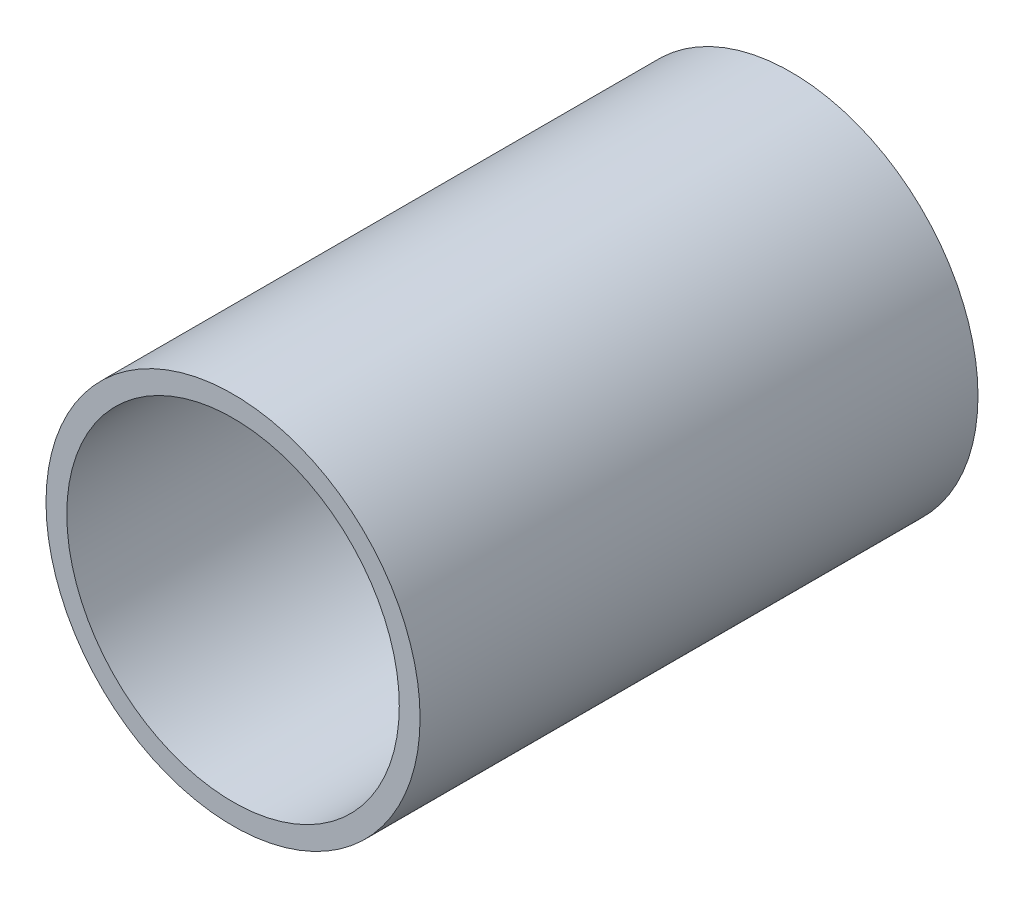
ISO-10303-21;
HEADER;
FILE_DESCRIPTION(('STEP AP214'),'2;1');
FILE_NAME('part.step','',(''),(''),'','','');
FILE_SCHEMA(('AUTOMOTIVE_DESIGN { 1 0 10303 214 1 1 1 1 }'));
ENDSEC;
DATA;
#1=APPLICATION_CONTEXT('core data for automotive mechanical design processes');
#2=APPLICATION_PROTOCOL_DEFINITION('international standard','automotive_design',2000,#1);
#3=PRODUCT_CONTEXT('',#1,'mechanical');
#4=PRODUCT('Part','Part','',(#3));
#5=PRODUCT_RELATED_PRODUCT_CATEGORY('part','',(#4));
#6=PRODUCT_DEFINITION_FORMATION('','',#4);
#7=PRODUCT_DEFINITION_CONTEXT('part definition',#1,'design');
#8=PRODUCT_DEFINITION('design','',#6,#7);
#9=PRODUCT_DEFINITION_SHAPE('','',#8);
#10=(LENGTH_UNIT() NAMED_UNIT(*) SI_UNIT(.MILLI.,.METRE.));
#11=(NAMED_UNIT(*) PLANE_ANGLE_UNIT() SI_UNIT($,.RADIAN.));
#12=(NAMED_UNIT(*) SI_UNIT($,.STERADIAN.) SOLID_ANGLE_UNIT());
#13=UNCERTAINTY_MEASURE_WITH_UNIT(LENGTH_MEASURE(1.E-05),#10,'distance_accuracy_value','');
#14=(GEOMETRIC_REPRESENTATION_CONTEXT(3) GLOBAL_UNCERTAINTY_ASSIGNED_CONTEXT((#13)) GLOBAL_UNIT_ASSIGNED_CONTEXT((#10,
#11,#12)) REPRESENTATION_CONTEXT('',''));
#15=CARTESIAN_POINT('',(0.,0.,0.));
#16=DIRECTION('',(0.,0.,1.));
#17=DIRECTION('',(1.,0.,0.));
#18=AXIS2_PLACEMENT_3D('',#15,#16,#17);
#19=CARTESIAN_POINT('',(0.,0.,152.4));
#20=DIRECTION('',(0.,0.,-1.));
#21=DIRECTION('',(-1.,0.,0.));
#22=AXIS2_PLACEMENT_3D('',#19,#20,#21);
#23=CYLINDRICAL_SURFACE('',#22,28.575);
#24=CARTESIAN_POINT('',(0.,0.,-152.4));
#25=DIRECTION('',(0.,0.,1.));
#26=DIRECTION('',(1.,0.,0.));
#27=AXIS2_PLACEMENT_3D('',#24,#25,#26);
#28=CIRCLE('',#27,28.575);
#29=CARTESIAN_POINT('',(28.575,0.,-152.4));
#30=VERTEX_POINT('',#29);
#31=EDGE_CURVE('E11',#30,#30,#28,.T.);
#32=ORIENTED_EDGE('',*,*,#31,.T.);
#33=EDGE_LOOP('',(#32));
#34=FACE_BOUND('',#33,.T.);
#35=CARTESIAN_POINT('',(0.,0.,-67.16));
#36=DIRECTION('',(0.,0.,1.));
#37=DIRECTION('',(1.,0.,0.));
#38=AXIS2_PLACEMENT_3D('',#35,#36,#37);
#39=CIRCLE('',#38,28.575);
#40=CARTESIAN_POINT('',(28.575,0.,-67.16));
#41=VERTEX_POINT('',#40);
#42=EDGE_CURVE('E49',#41,#41,#39,.F.);
#43=ORIENTED_EDGE('',*,*,#42,.T.);
#44=EDGE_LOOP('',(#43));
#45=FACE_BOUND('',#44,.T.);
#46=ADVANCED_FACE('F36',(#34,#45),#23,.T.);
#47=CARTESIAN_POINT('',(0.,0.,152.4));
#48=DIRECTION('',(0.,0.,-1.));
#49=DIRECTION('',(-1.,0.,0.));
#50=AXIS2_PLACEMENT_3D('',#47,#48,#49);
#51=CYLINDRICAL_SURFACE('',#50,25.4);
#52=CARTESIAN_POINT('',(0.,0.,-152.4));
#53=DIRECTION('',(0.,0.,1.));
#54=DIRECTION('',(1.,0.,0.));
#55=AXIS2_PLACEMENT_3D('',#52,#53,#54);
#56=CIRCLE('',#55,25.4);
#57=CARTESIAN_POINT('',(25.4,0.,-152.4));
#58=VERTEX_POINT('',#57);
#59=EDGE_CURVE('E43',#58,#58,#56,.T.);
#60=ORIENTED_EDGE('',*,*,#59,.F.);
#61=EDGE_LOOP('',(#60));
#62=FACE_BOUND('',#61,.T.);
#63=CARTESIAN_POINT('',(0.,0.,-67.16));
#64=DIRECTION('',(0.,0.,1.));
#65=DIRECTION('',(1.,0.,0.));
#66=AXIS2_PLACEMENT_3D('',#63,#64,#65);
#67=CIRCLE('',#66,25.4);
#68=CARTESIAN_POINT('',(25.4,0.,-67.16));
#69=VERTEX_POINT('',#68);
#70=EDGE_CURVE('E39',#69,#69,#67,.T.);
#71=ORIENTED_EDGE('',*,*,#70,.T.);
#72=EDGE_LOOP('',(#71));
#73=FACE_BOUND('',#72,.T.);
#74=ADVANCED_FACE('F56',(#62,#73),#51,.F.);
#75=CARTESIAN_POINT('',(0.,0.,-152.4));
#76=DIRECTION('',(0.,0.,1.));
#77=DIRECTION('',(1.,0.,0.));
#78=AXIS2_PLACEMENT_3D('',#75,#76,#77);
#79=PLANE('',#78);
#80=ORIENTED_EDGE('',*,*,#59,.T.);
#81=EDGE_LOOP('',(#80));
#82=FACE_BOUND('',#81,.T.);
#83=ORIENTED_EDGE('',*,*,#31,.F.);
#84=EDGE_LOOP('',(#83));
#85=FACE_BOUND('',#84,.T.);
#86=ADVANCED_FACE('F61',(#82,#85),#79,.F.);
#87=CARTESIAN_POINT('',(0.,0.,-67.16));
#88=DIRECTION('',(0.,0.,1.));
#89=DIRECTION('',(1.,0.,0.));
#90=AXIS2_PLACEMENT_3D('',#87,#88,#89);
#91=PLANE('',#90);
#92=ORIENTED_EDGE('',*,*,#70,.F.);
#93=EDGE_LOOP('',(#92));
#94=FACE_BOUND('',#93,.T.);
#95=ORIENTED_EDGE('',*,*,#42,.F.);
#96=EDGE_LOOP('',(#95));
#97=FACE_BOUND('',#96,.T.);
#98=ADVANCED_FACE('F58',(#94,#97),#91,.T.);
#99=CLOSED_SHELL('',(#46,#74,#86,#98));
#100=MANIFOLD_SOLID_BREP('B2',#99);
#101=ADVANCED_BREP_SHAPE_REPRESENTATION('',(#18,#100),#14);
#102=SHAPE_DEFINITION_REPRESENTATION(#9,#101);
ENDSEC;
END-ISO-10303-21;
